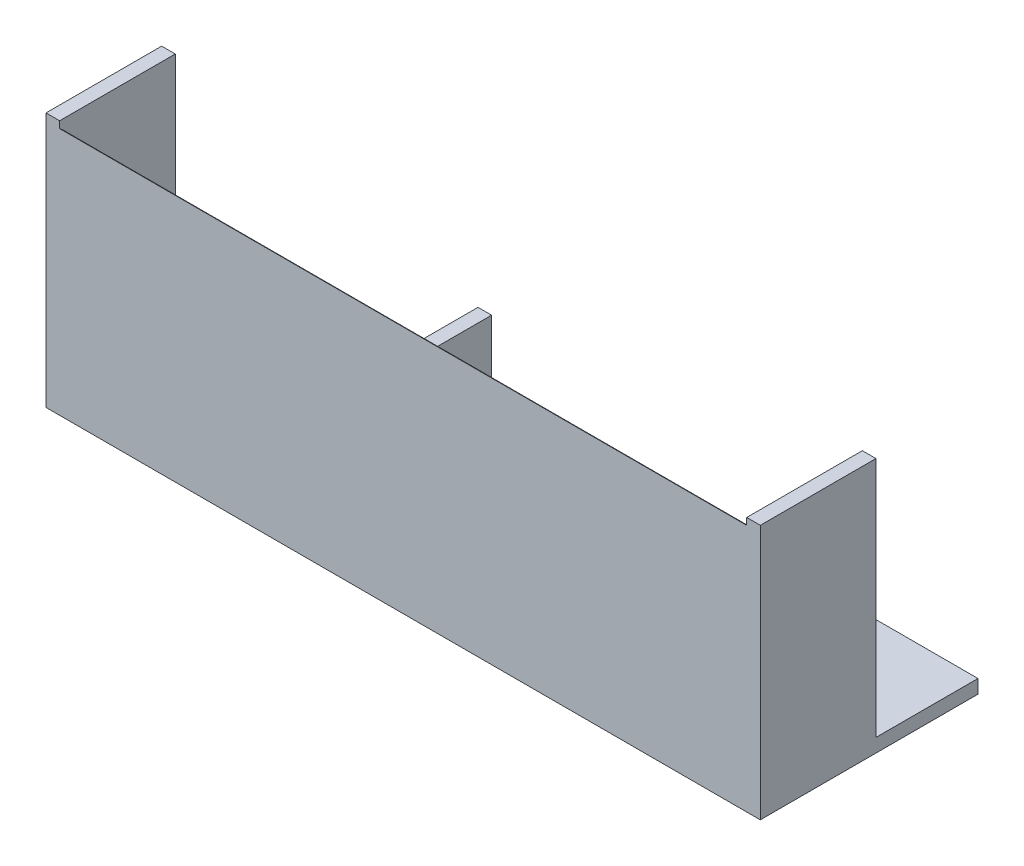
ISO-10303-21;
HEADER;
FILE_DESCRIPTION(('STEP AP214'),'2;1');
FILE_NAME('part.step','',(''),(''),'','','');
FILE_SCHEMA(('AUTOMOTIVE_DESIGN { 1 0 10303 214 1 1 1 1 }'));
ENDSEC;
DATA;
#1=APPLICATION_CONTEXT('core data for automotive mechanical design processes');
#2=APPLICATION_PROTOCOL_DEFINITION('international standard','automotive_design',2000,#1);
#3=PRODUCT_CONTEXT('',#1,'mechanical');
#4=PRODUCT('Part','Part','',(#3));
#5=PRODUCT_RELATED_PRODUCT_CATEGORY('part','',(#4));
#6=PRODUCT_DEFINITION_FORMATION('','',#4);
#7=PRODUCT_DEFINITION_CONTEXT('part definition',#1,'design');
#8=PRODUCT_DEFINITION('design','',#6,#7);
#9=PRODUCT_DEFINITION_SHAPE('','',#8);
#10=(LENGTH_UNIT() NAMED_UNIT(*) SI_UNIT(.MILLI.,.METRE.));
#11=(NAMED_UNIT(*) PLANE_ANGLE_UNIT() SI_UNIT($,.RADIAN.));
#12=(NAMED_UNIT(*) SI_UNIT($,.STERADIAN.) SOLID_ANGLE_UNIT());
#13=UNCERTAINTY_MEASURE_WITH_UNIT(LENGTH_MEASURE(1.E-05),#10,'distance_accuracy_value','');
#14=(GEOMETRIC_REPRESENTATION_CONTEXT(3) GLOBAL_UNCERTAINTY_ASSIGNED_CONTEXT((#13)) GLOBAL_UNIT_ASSIGNED_CONTEXT((#10,
#11,#12)) REPRESENTATION_CONTEXT('',''));
#15=CARTESIAN_POINT('',(0.,0.,0.));
#16=DIRECTION('',(0.,0.,1.));
#17=DIRECTION('',(1.,0.,0.));
#18=AXIS2_PLACEMENT_3D('',#15,#16,#17);
#19=CARTESIAN_POINT('',(0.,0.,0.));
#20=DIRECTION('',(0.,0.,1.));
#21=DIRECTION('',(1.,0.,0.));
#22=AXIS2_PLACEMENT_3D('',#19,#20,#21);
#23=PLANE('',#22);
#24=DIRECTION('',(0.,1.,0.));
#25=VECTOR('',#24,1.);
#26=CARTESIAN_POINT('',(-11.9657534246575,48.4349315068493,0.));
#27=LINE('',#26,#25);
#28=CARTESIAN_POINT('',(-11.9657534246575,48.4349315068493,0.));
#29=VERTEX_POINT('',#28);
#30=CARTESIAN_POINT('',(-11.9657534246575,109.434931506849,0.));
#31=VERTEX_POINT('',#30);
#32=EDGE_CURVE('E173',#29,#31,#27,.T.);
#33=ORIENTED_EDGE('',*,*,#32,.F.);
#34=DIRECTION('',(-1.,0.,0.));
#35=VECTOR('',#34,1.);
#36=CARTESIAN_POINT('',(-114.965753424658,48.4349315068493,0.));
#37=LINE('',#36,#35);
#38=CARTESIAN_POINT('',(-110.965753424658,48.4349315068493,0.));
#39=VERTEX_POINT('',#38);
#40=EDGE_CURVE('E230',#29,#39,#37,.T.);
#41=ORIENTED_EDGE('',*,*,#40,.T.);
#42=DIRECTION('',(0.,1.,0.));
#43=VECTOR('',#42,1.);
#44=CARTESIAN_POINT('',(-110.965753424658,119.434931506849,0.));
#45=LINE('',#44,#43);
#46=CARTESIAN_POINT('',(-110.965753424658,109.434931506849,0.));
#47=VERTEX_POINT('',#46);
#48=EDGE_CURVE('E204',#39,#47,#45,.T.);
#49=ORIENTED_EDGE('',*,*,#48,.T.);
#50=DIRECTION('',(-1.,0.,0.));
#51=VECTOR('',#50,1.);
#52=CARTESIAN_POINT('',(0.,109.434931506849,0.));
#53=LINE('',#52,#51);
#54=EDGE_CURVE('E302',#47,#31,#53,.F.);
#55=ORIENTED_EDGE('',*,*,#54,.T.);
#56=EDGE_LOOP('',(#33,#41,#49,#55));
#57=FACE_BOUND('',#56,.T.);
#58=ADVANCED_FACE('F39',(#57),#23,.F.);
#59=DIRECTION('',(0.,-1.,0.));
#60=VECTOR('',#59,1.);
#61=CARTESIAN_POINT('',(-7.96575342465753,48.4349315068493,0.));
#62=LINE('',#61,#60);
#63=CARTESIAN_POINT('',(-7.96575342465752,109.434931506849,0.));
#64=VERTEX_POINT('',#63);
#65=CARTESIAN_POINT('',(-7.96575342465752,48.4349315068493,0.));
#66=VERTEX_POINT('',#65);
#67=EDGE_CURVE('E170',#64,#66,#62,.T.);
#68=ORIENTED_EDGE('',*,*,#67,.F.);
#69=CARTESIAN_POINT('',(91.0342465753425,109.434931506849,0.));
#70=VERTEX_POINT('',#69);
#71=EDGE_CURVE('E301',#64,#70,#53,.F.);
#72=ORIENTED_EDGE('',*,*,#71,.T.);
#73=DIRECTION('',(0.,-1.,0.));
#74=VECTOR('',#73,1.);
#75=CARTESIAN_POINT('',(91.0342465753425,119.434931506849,0.));
#76=LINE('',#75,#74);
#77=CARTESIAN_POINT('',(91.0342465753425,48.4349315068493,0.));
#78=VERTEX_POINT('',#77);
#79=EDGE_CURVE('E175',#70,#78,#76,.T.);
#80=ORIENTED_EDGE('',*,*,#79,.T.);
#81=EDGE_CURVE('E239',#78,#66,#37,.T.);
#82=ORIENTED_EDGE('',*,*,#81,.T.);
#83=EDGE_LOOP('',(#68,#72,#80,#82));
#84=FACE_BOUND('',#83,.T.);
#85=ADVANCED_FACE('F334',(#84),#23,.F.);
#86=CARTESIAN_POINT('',(-114.965753424658,48.4349315068493,-60.));
#87=DIRECTION('',(0.,1.,0.));
#88=DIRECTION('',(0.,0.,1.));
#89=AXIS2_PLACEMENT_3D('',#86,#87,#88);
#90=PLANE('',#89);
#91=ORIENTED_EDGE('',*,*,#40,.F.);
#92=DIRECTION('',(0.,0.,1.));
#93=VECTOR('',#92,1.);
#94=CARTESIAN_POINT('',(-11.9657534246575,48.4349315068493,-20.));
#95=LINE('',#94,#93);
#96=CARTESIAN_POINT('',(-11.9657534246575,48.4349315068493,-20.));
#97=VERTEX_POINT('',#96);
#98=EDGE_CURVE('E55',#97,#29,#95,.T.);
#99=ORIENTED_EDGE('',*,*,#98,.F.);
#100=DIRECTION('',(-1.,0.,0.));
#101=VECTOR('',#100,1.);
#102=CARTESIAN_POINT('',(-11.9657534246575,48.4349315068493,-20.));
#103=LINE('',#102,#101);
#104=CARTESIAN_POINT('',(-7.96575342465752,48.4349315068493,-20.));
#105=VERTEX_POINT('',#104);
#106=EDGE_CURVE('E59',#105,#97,#103,.T.);
#107=ORIENTED_EDGE('',*,*,#106,.F.);
#108=DIRECTION('',(0.,0.,1.));
#109=VECTOR('',#108,1.);
#110=CARTESIAN_POINT('',(-7.96575342465753,48.4349315068493,-20.));
#111=LINE('',#110,#109);
#112=EDGE_CURVE('E181',#105,#66,#111,.T.);
#113=ORIENTED_EDGE('',*,*,#112,.T.);
#114=ORIENTED_EDGE('',*,*,#81,.F.);
#115=DIRECTION('',(0.,0.,1.));
#116=VECTOR('',#115,1.);
#117=CARTESIAN_POINT('',(91.0342465753425,48.4349315068493,-30.));
#118=LINE('',#117,#116);
#119=CARTESIAN_POINT('',(91.0342465753425,48.4349315068493,-30.));
#120=VERTEX_POINT('',#119);
#121=EDGE_CURVE('E200',#120,#78,#118,.T.);
#122=ORIENTED_EDGE('',*,*,#121,.F.);
#123=DIRECTION('',(1.,0.,0.));
#124=VECTOR('',#123,1.);
#125=CARTESIAN_POINT('',(95.0342465753425,48.4349315068493,-30.));
#126=LINE('',#125,#124);
#127=CARTESIAN_POINT('',(95.0342465753425,48.4349315068493,-30.));
#128=VERTEX_POINT('',#127);
#129=EDGE_CURVE('E196',#120,#128,#126,.T.);
#130=ORIENTED_EDGE('',*,*,#129,.T.);
#131=DIRECTION('',(0.,0.,1.));
#132=VECTOR('',#131,1.);
#133=CARTESIAN_POINT('',(95.0342465753425,48.4349315068493,-60.));
#134=LINE('',#133,#132);
#135=CARTESIAN_POINT('',(95.0342465753425,48.4349315068493,-60.));
#136=VERTEX_POINT('',#135);
#137=EDGE_CURVE('E251',#136,#128,#134,.T.);
#138=ORIENTED_EDGE('',*,*,#137,.F.);
#139=DIRECTION('',(-1.,0.,0.));
#140=VECTOR('',#139,1.);
#141=CARTESIAN_POINT('',(-114.965753424658,48.4349315068493,-60.));
#142=LINE('',#141,#140);
#143=CARTESIAN_POINT('',(-114.965753424658,48.4349315068493,-60.));
#144=VERTEX_POINT('',#143);
#145=EDGE_CURVE('E247',#136,#144,#142,.T.);
#146=ORIENTED_EDGE('',*,*,#145,.T.);
#147=DIRECTION('',(0.,0.,1.));
#148=VECTOR('',#147,1.);
#149=CARTESIAN_POINT('',(-114.965753424658,48.4349315068493,-60.));
#150=LINE('',#149,#148);
#151=CARTESIAN_POINT('',(-114.965753424658,48.4349315068493,-30.));
#152=VERTEX_POINT('',#151);
#153=EDGE_CURVE('E255',#144,#152,#150,.T.);
#154=ORIENTED_EDGE('',*,*,#153,.T.);
#155=DIRECTION('',(1.,0.,0.));
#156=VECTOR('',#155,1.);
#157=CARTESIAN_POINT('',(-114.965753424658,48.4349315068493,-30.));
#158=LINE('',#157,#156);
#159=CARTESIAN_POINT('',(-110.965753424658,48.4349315068493,-30.));
#160=VERTEX_POINT('',#159);
#161=EDGE_CURVE('E211',#152,#160,#158,.T.);
#162=ORIENTED_EDGE('',*,*,#161,.T.);
#163=DIRECTION('',(0.,0.,1.));
#164=VECTOR('',#163,1.);
#165=CARTESIAN_POINT('',(-110.965753424658,48.4349315068493,-30.));
#166=LINE('',#165,#164);
#167=EDGE_CURVE('E223',#160,#39,#166,.T.);
#168=ORIENTED_EDGE('',*,*,#167,.T.);
#169=EDGE_LOOP('',(#91,#99,#107,#113,#114,#122,#130,#138,#146,#154,#162,#168));
#170=FACE_BOUND('',#169,.T.);
#171=ADVANCED_FACE('F331',(#170),#90,.T.);
#172=CARTESIAN_POINT('',(-114.965753424658,119.434931506849,4.));
#173=DIRECTION('',(0.,-1.,0.));
#174=DIRECTION('',(0.,0.,-1.));
#175=AXIS2_PLACEMENT_3D('',#172,#173,#174);
#176=PLANE('',#175);
#177=DIRECTION('',(-1.,0.,0.));
#178=VECTOR('',#177,1.);
#179=CARTESIAN_POINT('',(-114.965753424658,119.434931506849,4.));
#180=LINE('',#179,#178);
#181=CARTESIAN_POINT('',(-110.965753424658,119.434931506849,4.));
#182=VERTEX_POINT('',#181);
#183=CARTESIAN_POINT('',(-114.965753424658,119.434931506849,4.));
#184=VERTEX_POINT('',#183);
#185=EDGE_CURVE('E266',#182,#184,#180,.T.);
#186=ORIENTED_EDGE('',*,*,#185,.F.);
#187=DIRECTION('',(0.,0.,1.));
#188=VECTOR('',#187,1.);
#189=CARTESIAN_POINT('',(-110.965753424658,119.434931506849,-30.));
#190=LINE('',#189,#188);
#191=CARTESIAN_POINT('',(-110.965753424658,119.434931506849,-30.));
#192=VERTEX_POINT('',#191);
#193=EDGE_CURVE('E227',#192,#182,#190,.T.);
#194=ORIENTED_EDGE('',*,*,#193,.F.);
#195=DIRECTION('',(-1.,0.,0.));
#196=VECTOR('',#195,1.);
#197=CARTESIAN_POINT('',(-114.965753424658,119.434931506849,-30.));
#198=LINE('',#197,#196);
#199=CARTESIAN_POINT('',(-114.965753424658,119.434931506849,-30.));
#200=VERTEX_POINT('',#199);
#201=EDGE_CURVE('E219',#192,#200,#198,.T.);
#202=ORIENTED_EDGE('',*,*,#201,.T.);
#203=DIRECTION('',(0.,0.,-1.));
#204=VECTOR('',#203,1.);
#205=CARTESIAN_POINT('',(-114.965753424658,119.434931506849,4.));
#206=LINE('',#205,#204);
#207=EDGE_CURVE('E283',#184,#200,#206,.T.);
#208=ORIENTED_EDGE('',*,*,#207,.F.);
#209=EDGE_LOOP('',(#186,#194,#202,#208));
#210=FACE_BOUND('',#209,.T.);
#211=ADVANCED_FACE('F369',(#210),#176,.F.);
#212=CARTESIAN_POINT('',(95.0342465753425,119.434931506849,4.));
#213=DIRECTION('',(-1.,0.,0.));
#214=DIRECTION('',(0.,0.,1.));
#215=AXIS2_PLACEMENT_3D('',#212,#213,#214);
#216=PLANE('',#215);
#217=DIRECTION('',(0.,1.,0.));
#218=VECTOR('',#217,1.);
#219=CARTESIAN_POINT('',(95.0342465753425,119.434931506849,-30.));
#220=LINE('',#219,#218);
#221=CARTESIAN_POINT('',(95.0342465753425,119.434931506849,-30.));
#222=VERTEX_POINT('',#221);
#223=EDGE_CURVE('E179',#128,#222,#220,.T.);
#224=ORIENTED_EDGE('',*,*,#223,.T.);
#225=DIRECTION('',(0.,0.,-1.));
#226=VECTOR('',#225,1.);
#227=CARTESIAN_POINT('',(95.0342465753425,119.434931506849,4.));
#228=LINE('',#227,#226);
#229=CARTESIAN_POINT('',(95.0342465753425,119.434931506849,4.));
#230=VERTEX_POINT('',#229);
#231=EDGE_CURVE('E286',#230,#222,#228,.T.);
#232=ORIENTED_EDGE('',*,*,#231,.F.);
#233=DIRECTION('',(0.,1.,0.));
#234=VECTOR('',#233,1.);
#235=CARTESIAN_POINT('',(95.0342465753425,119.434931506849,4.));
#236=LINE('',#235,#234);
#237=CARTESIAN_POINT('',(95.0342465753425,44.4349315068493,4.));
#238=VERTEX_POINT('',#237);
#239=EDGE_CURVE('E259',#238,#230,#236,.T.);
#240=ORIENTED_EDGE('',*,*,#239,.F.);
#241=DIRECTION('',(0.,0.,-1.));
#242=VECTOR('',#241,1.);
#243=CARTESIAN_POINT('',(95.0342465753425,44.4349315068493,4.));
#244=LINE('',#243,#242);
#245=CARTESIAN_POINT('',(95.0342465753425,44.4349315068493,-60.));
#246=VERTEX_POINT('',#245);
#247=EDGE_CURVE('E277',#238,#246,#244,.T.);
#248=ORIENTED_EDGE('',*,*,#247,.T.);
#249=DIRECTION('',(0.,1.,0.));
#250=VECTOR('',#249,1.);
#251=CARTESIAN_POINT('',(95.0342465753425,44.4349315068493,-60.));
#252=LINE('',#251,#250);
#253=EDGE_CURVE('E243',#246,#136,#252,.T.);
#254=ORIENTED_EDGE('',*,*,#253,.T.);
#255=ORIENTED_EDGE('',*,*,#137,.T.);
#256=EDGE_LOOP('',(#224,#232,#240,#248,#254,#255));
#257=FACE_BOUND('',#256,.T.);
#258=ADVANCED_FACE('F367',(#257),#216,.F.);
#259=DIRECTION('',(0.,0.,1.));
#260=VECTOR('',#259,1.);
#261=CARTESIAN_POINT('',(91.0342465753425,119.434931506849,-30.));
#262=LINE('',#261,#260);
#263=CARTESIAN_POINT('',(91.0342465753425,119.434931506849,-30.));
#264=VERTEX_POINT('',#263);
#265=CARTESIAN_POINT('',(91.0342465753425,119.434931506849,4.));
#266=VERTEX_POINT('',#265);
#267=EDGE_CURVE('E198',#264,#266,#262,.T.);
#268=ORIENTED_EDGE('',*,*,#267,.T.);
#269=EDGE_CURVE('E267',#230,#266,#180,.T.);
#270=ORIENTED_EDGE('',*,*,#269,.F.);
#271=ORIENTED_EDGE('',*,*,#231,.T.);
#272=DIRECTION('',(-1.,0.,0.));
#273=VECTOR('',#272,1.);
#274=CARTESIAN_POINT('',(95.0342465753425,119.434931506849,-30.));
#275=LINE('',#274,#273);
#276=EDGE_CURVE('E188',#222,#264,#275,.T.);
#277=ORIENTED_EDGE('',*,*,#276,.T.);
#278=EDGE_LOOP('',(#268,#270,#271,#277));
#279=FACE_BOUND('',#278,.T.);
#280=ADVANCED_FACE('F364',(#279),#176,.F.);
#281=CARTESIAN_POINT('',(-114.965753424658,119.434931506849,4.));
#282=DIRECTION('',(1.,0.,0.));
#283=DIRECTION('',(0.,1.,0.));
#284=AXIS2_PLACEMENT_3D('',#281,#282,#283);
#285=PLANE('',#284);
#286=ORIENTED_EDGE('',*,*,#207,.T.);
#287=DIRECTION('',(0.,-1.,0.));
#288=VECTOR('',#287,1.);
#289=CARTESIAN_POINT('',(-114.965753424658,119.434931506849,-30.));
#290=LINE('',#289,#288);
#291=EDGE_CURVE('E207',#200,#152,#290,.T.);
#292=ORIENTED_EDGE('',*,*,#291,.T.);
#293=ORIENTED_EDGE('',*,*,#153,.F.);
#294=DIRECTION('',(0.,-1.,0.));
#295=VECTOR('',#294,1.);
#296=CARTESIAN_POINT('',(-114.965753424658,44.4349315068493,-60.));
#297=LINE('',#296,#295);
#298=CARTESIAN_POINT('',(-114.965753424658,44.4349315068493,-60.));
#299=VERTEX_POINT('',#298);
#300=EDGE_CURVE('E234',#144,#299,#297,.T.);
#301=ORIENTED_EDGE('',*,*,#300,.T.);
#302=DIRECTION('',(0.,0.,-1.));
#303=VECTOR('',#302,1.);
#304=CARTESIAN_POINT('',(-114.965753424658,44.4349315068493,4.));
#305=LINE('',#304,#303);
#306=CARTESIAN_POINT('',(-114.965753424658,44.4349315068493,4.));
#307=VERTEX_POINT('',#306);
#308=EDGE_CURVE('E280',#307,#299,#305,.T.);
#309=ORIENTED_EDGE('',*,*,#308,.F.);
#310=DIRECTION('',(0.,-1.,0.));
#311=VECTOR('',#310,1.);
#312=CARTESIAN_POINT('',(-114.965753424658,119.434931506849,4.));
#313=LINE('',#312,#311);
#314=EDGE_CURVE('E271',#184,#307,#313,.T.);
#315=ORIENTED_EDGE('',*,*,#314,.F.);
#316=EDGE_LOOP('',(#286,#292,#293,#301,#309,#315));
#317=FACE_BOUND('',#316,.T.);
#318=ADVANCED_FACE('F360',(#317),#285,.F.);
#319=CARTESIAN_POINT('',(-114.965753424658,44.4349315068493,4.));
#320=DIRECTION('',(0.,1.,0.));
#321=DIRECTION('',(-1.,0.,0.));
#322=AXIS2_PLACEMENT_3D('',#319,#320,#321);
#323=PLANE('',#322);
#324=ORIENTED_EDGE('',*,*,#308,.T.);
#325=DIRECTION('',(1.,0.,0.));
#326=VECTOR('',#325,1.);
#327=CARTESIAN_POINT('',(-114.965753424658,44.4349315068493,-60.));
#328=LINE('',#327,#326);
#329=EDGE_CURVE('E238',#299,#246,#328,.T.);
#330=ORIENTED_EDGE('',*,*,#329,.T.);
#331=ORIENTED_EDGE('',*,*,#247,.F.);
#332=DIRECTION('',(1.,0.,0.));
#333=VECTOR('',#332,1.);
#334=CARTESIAN_POINT('',(-114.965753424658,44.4349315068493,4.));
#335=LINE('',#334,#333);
#336=EDGE_CURVE('E274',#307,#238,#335,.T.);
#337=ORIENTED_EDGE('',*,*,#336,.F.);
#338=EDGE_LOOP('',(#324,#330,#331,#337));
#339=FACE_BOUND('',#338,.T.);
#340=ADVANCED_FACE('F357',(#339),#323,.F.);
#341=CARTESIAN_POINT('',(0.,0.,4.));
#342=DIRECTION('',(0.,0.,1.));
#343=DIRECTION('',(1.,0.,0.));
#344=AXIS2_PLACEMENT_3D('',#341,#342,#343);
#345=PLANE('',#344);
#346=DIRECTION('',(-1.,0.,0.));
#347=VECTOR('',#346,1.);
#348=CARTESIAN_POINT('',(-9.96575342465752,117.434931506849,4.));
#349=LINE('',#348,#347);
#350=CARTESIAN_POINT('',(91.0342465753425,117.434931506849,4.));
#351=VERTEX_POINT('',#350);
#352=CARTESIAN_POINT('',(-110.965753424658,117.434931506849,4.));
#353=VERTEX_POINT('',#352);
#354=EDGE_CURVE('E293',#351,#353,#349,.T.);
#355=ORIENTED_EDGE('',*,*,#354,.T.);
#356=DIRECTION('',(0.,1.,0.));
#357=VECTOR('',#356,1.);
#358=CARTESIAN_POINT('',(-110.965753424658,0.,4.));
#359=LINE('',#358,#357);
#360=EDGE_CURVE('E297',#353,#182,#359,.T.);
#361=ORIENTED_EDGE('',*,*,#360,.T.);
#362=ORIENTED_EDGE('',*,*,#185,.T.);
#363=ORIENTED_EDGE('',*,*,#314,.T.);
#364=ORIENTED_EDGE('',*,*,#336,.T.);
#365=ORIENTED_EDGE('',*,*,#239,.T.);
#366=ORIENTED_EDGE('',*,*,#269,.T.);
#367=DIRECTION('',(0.,-1.,0.));
#368=VECTOR('',#367,1.);
#369=CARTESIAN_POINT('',(91.0342465753425,0.,4.));
#370=LINE('',#369,#368);
#371=EDGE_CURVE('E289',#266,#351,#370,.T.);
#372=ORIENTED_EDGE('',*,*,#371,.T.);
#373=EDGE_LOOP('',(#355,#361,#362,#363,#364,#365,#366,#372));
#374=FACE_BOUND('',#373,.T.);
#375=ADVANCED_FACE('F355',(#374),#345,.T.);
#376=CARTESIAN_POINT('',(0.,0.,-60.));
#377=DIRECTION('',(0.,0.,-1.));
#378=DIRECTION('',(-1.,0.,0.));
#379=AXIS2_PLACEMENT_3D('',#376,#377,#378);
#380=PLANE('',#379);
#381=ORIENTED_EDGE('',*,*,#300,.F.);
#382=ORIENTED_EDGE('',*,*,#145,.F.);
#383=ORIENTED_EDGE('',*,*,#253,.F.);
#384=ORIENTED_EDGE('',*,*,#329,.F.);
#385=EDGE_LOOP('',(#381,#382,#383,#384));
#386=FACE_BOUND('',#385,.T.);
#387=ADVANCED_FACE('F393',(#386),#380,.T.);
#388=CARTESIAN_POINT('',(-110.965753424658,119.434931506849,-30.));
#389=DIRECTION('',(1.,0.,0.));
#390=DIRECTION('',(0.,0.,-1.));
#391=AXIS2_PLACEMENT_3D('',#388,#389,#390);
#392=PLANE('',#391);
#393=ORIENTED_EDGE('',*,*,#48,.F.);
#394=ORIENTED_EDGE('',*,*,#167,.F.);
#395=DIRECTION('',(0.,1.,0.));
#396=VECTOR('',#395,1.);
#397=CARTESIAN_POINT('',(-110.965753424658,119.434931506849,-30.));
#398=LINE('',#397,#396);
#399=EDGE_CURVE('E215',#160,#192,#398,.T.);
#400=ORIENTED_EDGE('',*,*,#399,.T.);
#401=ORIENTED_EDGE('',*,*,#193,.T.);
#402=ORIENTED_EDGE('',*,*,#360,.F.);
#403=CARTESIAN_POINT('',(-110.965753424658,109.434931506849,10.));
#404=DIRECTION('',(1.,0.,0.));
#405=DIRECTION('',(0.,0.,-1.));
#406=AXIS2_PLACEMENT_3D('',#403,#404,#405);
#407=CIRCLE('',#406,10.);
#408=EDGE_CURVE('E48',#353,#47,#407,.F.);
#409=ORIENTED_EDGE('',*,*,#408,.T.);
#410=EDGE_LOOP('',(#393,#394,#400,#401,#402,#409));
#411=FACE_BOUND('',#410,.T.);
#412=ADVANCED_FACE('F309',(#411),#392,.T.);
#413=CARTESIAN_POINT('',(0.,0.,-30.));
#414=DIRECTION('',(0.,0.,1.));
#415=DIRECTION('',(1.,0.,0.));
#416=AXIS2_PLACEMENT_3D('',#413,#414,#415);
#417=PLANE('',#416);
#418=ORIENTED_EDGE('',*,*,#291,.F.);
#419=ORIENTED_EDGE('',*,*,#201,.F.);
#420=ORIENTED_EDGE('',*,*,#399,.F.);
#421=ORIENTED_EDGE('',*,*,#161,.F.);
#422=EDGE_LOOP('',(#418,#419,#420,#421));
#423=FACE_BOUND('',#422,.T.);
#424=ADVANCED_FACE('F406',(#423),#417,.F.);
#425=CARTESIAN_POINT('',(91.0342465753425,119.434931506849,-30.));
#426=DIRECTION('',(-1.,0.,0.));
#427=DIRECTION('',(0.,-1.,0.));
#428=AXIS2_PLACEMENT_3D('',#425,#426,#427);
#429=PLANE('',#428);
#430=ORIENTED_EDGE('',*,*,#79,.F.);
#431=CARTESIAN_POINT('',(91.0342465753425,109.434931506849,10.));
#432=DIRECTION('',(-1.,0.,0.));
#433=DIRECTION('',(0.,-1.,0.));
#434=AXIS2_PLACEMENT_3D('',#431,#432,#433);
#435=CIRCLE('',#434,10.);
#436=EDGE_CURVE('E11',#70,#351,#435,.F.);
#437=ORIENTED_EDGE('',*,*,#436,.T.);
#438=ORIENTED_EDGE('',*,*,#371,.F.);
#439=ORIENTED_EDGE('',*,*,#267,.F.);
#440=DIRECTION('',(0.,-1.,0.));
#441=VECTOR('',#440,1.);
#442=CARTESIAN_POINT('',(91.0342465753425,119.434931506849,-30.));
#443=LINE('',#442,#441);
#444=EDGE_CURVE('E192',#264,#120,#443,.T.);
#445=ORIENTED_EDGE('',*,*,#444,.T.);
#446=ORIENTED_EDGE('',*,*,#121,.T.);
#447=EDGE_LOOP('',(#430,#437,#438,#439,#445,#446));
#448=FACE_BOUND('',#447,.T.);
#449=ADVANCED_FACE('F397',(#448),#429,.T.);
#450=CARTESIAN_POINT('',(0.,0.,-30.));
#451=DIRECTION('',(0.,0.,-1.));
#452=DIRECTION('',(-1.,0.,0.));
#453=AXIS2_PLACEMENT_3D('',#450,#451,#452);
#454=PLANE('',#453);
#455=ORIENTED_EDGE('',*,*,#223,.F.);
#456=ORIENTED_EDGE('',*,*,#129,.F.);
#457=ORIENTED_EDGE('',*,*,#444,.F.);
#458=ORIENTED_EDGE('',*,*,#276,.F.);
#459=EDGE_LOOP('',(#455,#456,#457,#458));
#460=FACE_BOUND('',#459,.T.);
#461=ADVANCED_FACE('F382',(#460),#454,.T.);
#462=CARTESIAN_POINT('',(-114.965753424658,109.434931506849,10.));
#463=DIRECTION('',(-1.,0.,0.));
#464=DIRECTION('',(0.,0.,1.));
#465=AXIS2_PLACEMENT_3D('',#462,#463,#464);
#466=CYLINDRICAL_SURFACE('',#465,10.);
#467=ORIENTED_EDGE('',*,*,#436,.F.);
#468=ORIENTED_EDGE('',*,*,#71,.F.);
#469=DIRECTION('',(1.,0.,0.));
#470=VECTOR('',#469,1.);
#471=CARTESIAN_POINT('',(-11.9657534246575,109.434931506849,0.));
#472=LINE('',#471,#470);
#473=EDGE_CURVE('E316',#31,#64,#472,.T.);
#474=ORIENTED_EDGE('',*,*,#473,.F.);
#475=ORIENTED_EDGE('',*,*,#54,.F.);
#476=ORIENTED_EDGE('',*,*,#408,.F.);
#477=ORIENTED_EDGE('',*,*,#354,.F.);
#478=EDGE_LOOP('',(#467,#468,#474,#475,#476,#477));
#479=FACE_BOUND('',#478,.T.);
#480=ADVANCED_FACE('F41',(#479),#466,.T.);
#481=CARTESIAN_POINT('',(-11.9657534246575,48.4349315068493,-20.));
#482=DIRECTION('',(1.,0.,0.));
#483=DIRECTION('',(0.,1.,0.));
#484=AXIS2_PLACEMENT_3D('',#481,#482,#483);
#485=PLANE('',#484);
#486=ORIENTED_EDGE('',*,*,#32,.T.);
#487=DIRECTION('',(0.,0.,1.));
#488=VECTOR('',#487,1.);
#489=CARTESIAN_POINT('',(-11.9657534246575,109.434931506849,-20.));
#490=LINE('',#489,#488);
#491=CARTESIAN_POINT('',(-11.9657534246575,109.434931506849,-20.));
#492=VERTEX_POINT('',#491);
#493=EDGE_CURVE('E156',#492,#31,#490,.T.);
#494=ORIENTED_EDGE('',*,*,#493,.F.);
#495=DIRECTION('',(0.,1.,0.));
#496=VECTOR('',#495,1.);
#497=CARTESIAN_POINT('',(-11.9657534246575,48.4349315068493,-20.));
#498=LINE('',#497,#496);
#499=EDGE_CURVE('E164',#97,#492,#498,.T.);
#500=ORIENTED_EDGE('',*,*,#499,.F.);
#501=ORIENTED_EDGE('',*,*,#98,.T.);
#502=EDGE_LOOP('',(#486,#494,#500,#501));
#503=FACE_BOUND('',#502,.T.);
#504=ADVANCED_FACE('F172',(#503),#485,.F.);
#505=CARTESIAN_POINT('',(-11.9657534246575,109.434931506849,-20.));
#506=DIRECTION('',(0.,-1.,0.));
#507=DIRECTION('',(0.,0.,-1.));
#508=AXIS2_PLACEMENT_3D('',#505,#506,#507);
#509=PLANE('',#508);
#510=ORIENTED_EDGE('',*,*,#473,.T.);
#511=DIRECTION('',(0.,0.,1.));
#512=VECTOR('',#511,1.);
#513=CARTESIAN_POINT('',(-7.96575342465752,109.434931506849,-20.));
#514=LINE('',#513,#512);
#515=CARTESIAN_POINT('',(-7.96575342465752,109.434931506849,-20.));
#516=VERTEX_POINT('',#515);
#517=EDGE_CURVE('E159',#516,#64,#514,.T.);
#518=ORIENTED_EDGE('',*,*,#517,.F.);
#519=DIRECTION('',(1.,0.,0.));
#520=VECTOR('',#519,1.);
#521=CARTESIAN_POINT('',(-11.9657534246575,109.434931506849,-20.));
#522=LINE('',#521,#520);
#523=EDGE_CURVE('E151',#492,#516,#522,.T.);
#524=ORIENTED_EDGE('',*,*,#523,.F.);
#525=ORIENTED_EDGE('',*,*,#493,.T.);
#526=EDGE_LOOP('',(#510,#518,#524,#525));
#527=FACE_BOUND('',#526,.T.);
#528=ADVANCED_FACE('F154',(#527),#509,.F.);
#529=CARTESIAN_POINT('',(-7.96575342465753,48.4349315068493,-20.));
#530=DIRECTION('',(-1.,0.,0.));
#531=DIRECTION('',(0.,-1.,0.));
#532=AXIS2_PLACEMENT_3D('',#529,#530,#531);
#533=PLANE('',#532);
#534=ORIENTED_EDGE('',*,*,#67,.T.);
#535=ORIENTED_EDGE('',*,*,#112,.F.);
#536=DIRECTION('',(0.,-1.,0.));
#537=VECTOR('',#536,1.);
#538=CARTESIAN_POINT('',(-7.96575342465753,48.4349315068493,-20.));
#539=LINE('',#538,#537);
#540=EDGE_CURVE('E163',#516,#105,#539,.T.);
#541=ORIENTED_EDGE('',*,*,#540,.F.);
#542=ORIENTED_EDGE('',*,*,#517,.T.);
#543=EDGE_LOOP('',(#534,#535,#541,#542));
#544=FACE_BOUND('',#543,.T.);
#545=ADVANCED_FACE('F336',(#544),#533,.F.);
#546=CARTESIAN_POINT('',(0.,0.,-20.));
#547=DIRECTION('',(0.,0.,-1.));
#548=DIRECTION('',(-1.,0.,0.));
#549=AXIS2_PLACEMENT_3D('',#546,#547,#548);
#550=PLANE('',#549);
#551=ORIENTED_EDGE('',*,*,#499,.T.);
#552=ORIENTED_EDGE('',*,*,#523,.T.);
#553=ORIENTED_EDGE('',*,*,#540,.T.);
#554=ORIENTED_EDGE('',*,*,#106,.T.);
#555=EDGE_LOOP('',(#551,#552,#553,#554));
#556=FACE_BOUND('',#555,.T.);
#557=ADVANCED_FACE('F167',(#556),#550,.T.);
#558=CLOSED_SHELL('',(#58,#85,#171,#211,#258,#280,#318,#340,#375,#387,#412,#424,#449,#461,#480,
#504,#528,#545,#557));
#559=MANIFOLD_SOLID_BREP('B2',#558);
#560=ADVANCED_BREP_SHAPE_REPRESENTATION('',(#18,#559),#14);
#561=SHAPE_DEFINITION_REPRESENTATION(#9,#560);
ENDSEC;
END-ISO-10303-21;
